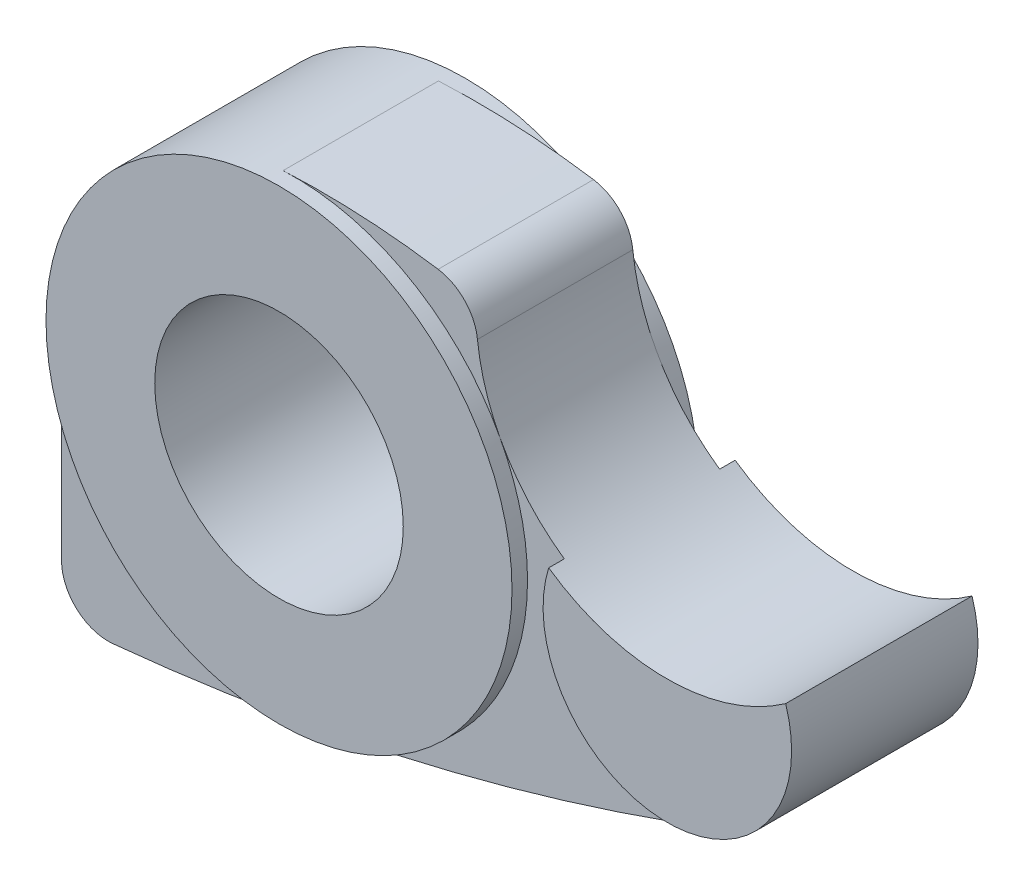
ISO-10303-21;
HEADER;
FILE_DESCRIPTION(('STEP AP214'),'2;1');
FILE_NAME('part.step','',(''),(''),'','','');
FILE_SCHEMA(('AUTOMOTIVE_DESIGN { 1 0 10303 214 1 1 1 1 }'));
ENDSEC;
DATA;
#1=APPLICATION_CONTEXT('core data for automotive mechanical design processes');
#2=APPLICATION_PROTOCOL_DEFINITION('international standard','automotive_design',2000,#1);
#3=PRODUCT_CONTEXT('',#1,'mechanical');
#4=PRODUCT('Part','Part','',(#3));
#5=PRODUCT_RELATED_PRODUCT_CATEGORY('part','',(#4));
#6=PRODUCT_DEFINITION_FORMATION('','',#4);
#7=PRODUCT_DEFINITION_CONTEXT('part definition',#1,'design');
#8=PRODUCT_DEFINITION('design','',#6,#7);
#9=PRODUCT_DEFINITION_SHAPE('','',#8);
#10=(LENGTH_UNIT() NAMED_UNIT(*) SI_UNIT(.MILLI.,.METRE.));
#11=(NAMED_UNIT(*) PLANE_ANGLE_UNIT() SI_UNIT($,.RADIAN.));
#12=(NAMED_UNIT(*) SI_UNIT($,.STERADIAN.) SOLID_ANGLE_UNIT());
#13=UNCERTAINTY_MEASURE_WITH_UNIT(LENGTH_MEASURE(1.E-05),#10,'distance_accuracy_value','');
#14=(GEOMETRIC_REPRESENTATION_CONTEXT(3) GLOBAL_UNCERTAINTY_ASSIGNED_CONTEXT((#13)) GLOBAL_UNIT_ASSIGNED_CONTEXT((#10,
#11,#12)) REPRESENTATION_CONTEXT('',''));
#15=CARTESIAN_POINT('',(0.,0.,0.));
#16=DIRECTION('',(0.,0.,1.));
#17=DIRECTION('',(1.,0.,0.));
#18=AXIS2_PLACEMENT_3D('',#15,#16,#17);
#19=CARTESIAN_POINT('',(0.,0.,5.));
#20=DIRECTION('',(0.,0.,1.));
#21=DIRECTION('',(1.,0.,0.));
#22=AXIS2_PLACEMENT_3D('',#19,#20,#21);
#23=PLANE('',#22);
#24=CARTESIAN_POINT('',(-26.2799999999999,132.417376503237,5.));
#25=DIRECTION('',(0.,0.,1.));
#26=DIRECTION('',(1.,0.,0.));
#27=AXIS2_PLACEMENT_3D('',#24,#25,#26);
#28=CIRCLE('',#27,150.);
#29=CARTESIAN_POINT('',(2.91999999999999,-14.713041833693,5.));
#30=VERTEX_POINT('',#29);
#31=CARTESIAN_POINT('',(27.889014084507,-7.4601338875063,5.));
#32=VERTEX_POINT('',#31);
#33=EDGE_CURVE('E175',#30,#32,#28,.T.);
#34=ORIENTED_EDGE('',*,*,#33,.T.);
#35=CARTESIAN_POINT('',(25.,0.,5.));
#36=DIRECTION('',(0.,0.,1.));
#37=DIRECTION('',(1.,0.,0.));
#38=AXIS2_PLACEMENT_3D('',#35,#36,#37);
#39=CIRCLE('',#38,8.);
#40=CARTESIAN_POINT('',(17.364205718864,2.38634567826439,5.));
#41=VERTEX_POINT('',#40);
#42=EDGE_CURVE('E56',#32,#41,#39,.F.);
#43=ORIENTED_EDGE('',*,*,#42,.T.);
#44=CARTESIAN_POINT('',(24.9499498997493,13.25,5.));
#45=DIRECTION('',(0.,0.,1.));
#46=DIRECTION('',(1.,0.,0.));
#47=AXIS2_PLACEMENT_3D('',#44,#45,#46);
#48=CIRCLE('',#47,13.25);
#49=CARTESIAN_POINT('',(13.2477610087165,7.0353982300885,5.));
#50=VERTEX_POINT('',#49);
#51=EDGE_CURVE('E149',#50,#41,#48,.T.);
#52=ORIENTED_EDGE('',*,*,#51,.F.);
#53=CARTESIAN_POINT('',(0.,0.,5.));
#54=DIRECTION('',(0.,0.,1.));
#55=DIRECTION('',(1.,0.,0.));
#56=AXIS2_PLACEMENT_3D('',#53,#54,#55);
#57=CIRCLE('',#56,15.);
#58=EDGE_CURVE('E159',#50,#30,#57,.F.);
#59=ORIENTED_EDGE('',*,*,#58,.T.);
#60=EDGE_LOOP('',(#34,#43,#52,#59));
#61=FACE_BOUND('',#60,.T.);
#62=ADVANCED_FACE('F41',(#61),#23,.T.);
#63=CARTESIAN_POINT('',(0.,0.,-5.));
#64=DIRECTION('',(0.,0.,1.));
#65=DIRECTION('',(1.,0.,0.));
#66=AXIS2_PLACEMENT_3D('',#63,#64,#65);
#67=PLANE('',#66);
#68=CARTESIAN_POINT('',(25.,0.,-5.));
#69=DIRECTION('',(0.,0.,1.));
#70=DIRECTION('',(1.,0.,0.));
#71=AXIS2_PLACEMENT_3D('',#68,#69,#70);
#72=CIRCLE('',#71,8.);
#73=CARTESIAN_POINT('',(27.889014084507,-7.46013388750631,-5.));
#74=VERTEX_POINT('',#73);
#75=CARTESIAN_POINT('',(17.364205718864,2.38634567826438,-5.));
#76=VERTEX_POINT('',#75);
#77=EDGE_CURVE('E11',#74,#76,#72,.F.);
#78=ORIENTED_EDGE('',*,*,#77,.F.);
#79=CARTESIAN_POINT('',(-26.2799999999999,132.417376503237,-5.));
#80=DIRECTION('',(0.,0.,1.));
#81=DIRECTION('',(1.,0.,0.));
#82=AXIS2_PLACEMENT_3D('',#79,#80,#81);
#83=CIRCLE('',#82,150.);
#84=CARTESIAN_POINT('',(2.91999999999999,-14.713041833693,-5.));
#85=VERTEX_POINT('',#84);
#86=EDGE_CURVE('E192',#85,#74,#83,.T.);
#87=ORIENTED_EDGE('',*,*,#86,.F.);
#88=CARTESIAN_POINT('',(0.,0.,-5.));
#89=DIRECTION('',(0.,0.,1.));
#90=DIRECTION('',(1.,0.,0.));
#91=AXIS2_PLACEMENT_3D('',#88,#89,#90);
#92=CIRCLE('',#91,15.);
#93=CARTESIAN_POINT('',(13.2477610087165,7.0353982300885,-5.));
#94=VERTEX_POINT('',#93);
#95=EDGE_CURVE('E213',#94,#85,#92,.F.);
#96=ORIENTED_EDGE('',*,*,#95,.F.);
#97=CARTESIAN_POINT('',(24.9499498997493,13.25,-5.));
#98=DIRECTION('',(0.,0.,1.));
#99=DIRECTION('',(1.,0.,0.));
#100=AXIS2_PLACEMENT_3D('',#97,#98,#99);
#101=CIRCLE('',#100,13.25);
#102=EDGE_CURVE('E183',#94,#76,#101,.T.);
#103=ORIENTED_EDGE('',*,*,#102,.T.);
#104=EDGE_LOOP('',(#78,#87,#96,#103));
#105=FACE_BOUND('',#104,.T.);
#106=ADVANCED_FACE('F259',(#105),#67,.F.);
#107=CARTESIAN_POINT('',(-11.7085714285714,-16.8731907452927,5.));
#108=VERTEX_POINT('',#107);
#109=EDGE_CURVE('E176',#108,#30,#28,.T.);
#110=ORIENTED_EDGE('',*,*,#109,.T.);
#111=CARTESIAN_POINT('',(-15.,0.,5.));
#112=VERTEX_POINT('',#111);
#113=EDGE_CURVE('E64',#30,#112,#57,.F.);
#114=ORIENTED_EDGE('',*,*,#113,.T.);
#115=DIRECTION('',(0.,-1.,0.));
#116=VECTOR('',#115,1.);
#117=CARTESIAN_POINT('',(-15.,0.,5.));
#118=LINE('',#117,#116);
#119=CARTESIAN_POINT('',(-15.,-13.8873794003221,5.));
#120=VERTEX_POINT('',#119);
#121=EDGE_CURVE('E171',#112,#120,#118,.T.);
#122=ORIENTED_EDGE('',*,*,#121,.T.);
#123=CARTESIAN_POINT('',(-12.,-13.8873794003221,5.));
#124=DIRECTION('',(0.,0.,1.));
#125=DIRECTION('',(1.,0.,0.));
#126=AXIS2_PLACEMENT_3D('',#123,#124,#125);
#127=CIRCLE('',#126,2.99999999999998);
#128=EDGE_CURVE('E173',#120,#108,#127,.T.);
#129=ORIENTED_EDGE('',*,*,#128,.T.);
#130=EDGE_LOOP('',(#110,#114,#122,#129));
#131=FACE_BOUND('',#130,.T.);
#132=ADVANCED_FACE('F236',(#131),#23,.T.);
#133=CARTESIAN_POINT('',(1.72,-34.9577115955836,5.));
#134=DIRECTION('',(0.,0.,1.));
#135=DIRECTION('',(1.,0.,0.));
#136=AXIS2_PLACEMENT_3D('',#133,#134,#135);
#137=CIRCLE('',#136,50.);
#138=CARTESIAN_POINT('',(9.24521977808166,14.4727553988882,5.));
#139=VERTEX_POINT('',#138);
#140=CARTESIAN_POINT('',(-0.737142857142858,14.9818763981073,5.));
#141=VERTEX_POINT('',#140);
#142=EDGE_CURVE('E168',#139,#141,#137,.T.);
#143=ORIENTED_EDGE('',*,*,#142,.T.);
#144=EDGE_CURVE('E163',#141,#50,#57,.F.);
#145=ORIENTED_EDGE('',*,*,#144,.T.);
#146=CARTESIAN_POINT('',(11.776397663708,11.8287254015178,5.));
#147=VERTEX_POINT('',#146);
#148=EDGE_CURVE('E164',#147,#50,#48,.T.);
#149=ORIENTED_EDGE('',*,*,#148,.F.);
#150=CARTESIAN_POINT('',(8.79370659139676,11.5069273792199,5.));
#151=DIRECTION('',(0.,0.,1.));
#152=DIRECTION('',(1.,0.,0.));
#153=AXIS2_PLACEMENT_3D('',#150,#151,#152);
#154=CIRCLE('',#153,3.);
#155=EDGE_CURVE('E166',#147,#139,#154,.T.);
#156=ORIENTED_EDGE('',*,*,#155,.T.);
#157=EDGE_LOOP('',(#143,#145,#149,#156));
#158=FACE_BOUND('',#157,.T.);
#159=ADVANCED_FACE('F241',(#158),#23,.T.);
#160=CARTESIAN_POINT('',(-15.,0.,-5.));
#161=VERTEX_POINT('',#160);
#162=EDGE_CURVE('E49',#85,#161,#92,.F.);
#163=ORIENTED_EDGE('',*,*,#162,.F.);
#164=CARTESIAN_POINT('',(-11.7085714285714,-16.8731907452927,-5.));
#165=VERTEX_POINT('',#164);
#166=EDGE_CURVE('E193',#165,#85,#83,.T.);
#167=ORIENTED_EDGE('',*,*,#166,.F.);
#168=CARTESIAN_POINT('',(-12.,-13.8873794003221,-5.));
#169=DIRECTION('',(0.,0.,1.));
#170=DIRECTION('',(1.,0.,0.));
#171=AXIS2_PLACEMENT_3D('',#168,#169,#170);
#172=CIRCLE('',#171,2.99999999999998);
#173=CARTESIAN_POINT('',(-15.,-13.8873794003221,-5.));
#174=VERTEX_POINT('',#173);
#175=EDGE_CURVE('E190',#174,#165,#172,.T.);
#176=ORIENTED_EDGE('',*,*,#175,.F.);
#177=DIRECTION('',(0.,-1.,0.));
#178=VECTOR('',#177,1.);
#179=CARTESIAN_POINT('',(-15.,0.,-5.));
#180=LINE('',#179,#178);
#181=EDGE_CURVE('E188',#161,#174,#180,.T.);
#182=ORIENTED_EDGE('',*,*,#181,.F.);
#183=EDGE_LOOP('',(#163,#167,#176,#182));
#184=FACE_BOUND('',#183,.T.);
#185=ADVANCED_FACE('F225',(#184),#67,.F.);
#186=CARTESIAN_POINT('',(-0.737142857142859,14.9818763981073,-5.));
#187=VERTEX_POINT('',#186);
#188=EDGE_CURVE('E215',#187,#94,#92,.F.);
#189=ORIENTED_EDGE('',*,*,#188,.F.);
#190=CARTESIAN_POINT('',(1.72,-34.9577115955836,-5.));
#191=DIRECTION('',(0.,0.,1.));
#192=DIRECTION('',(1.,0.,0.));
#193=AXIS2_PLACEMENT_3D('',#190,#191,#192);
#194=CIRCLE('',#193,50.);
#195=CARTESIAN_POINT('',(9.24521977808166,14.4727553988882,-5.));
#196=VERTEX_POINT('',#195);
#197=EDGE_CURVE('E185',#196,#187,#194,.T.);
#198=ORIENTED_EDGE('',*,*,#197,.F.);
#199=CARTESIAN_POINT('',(8.79370659139676,11.5069273792199,-5.));
#200=DIRECTION('',(0.,0.,1.));
#201=DIRECTION('',(1.,0.,0.));
#202=AXIS2_PLACEMENT_3D('',#199,#200,#201);
#203=CIRCLE('',#202,3.);
#204=CARTESIAN_POINT('',(11.776397663708,11.8287254015178,-5.));
#205=VERTEX_POINT('',#204);
#206=EDGE_CURVE('E182',#205,#196,#203,.T.);
#207=ORIENTED_EDGE('',*,*,#206,.F.);
#208=EDGE_CURVE('E179',#205,#94,#101,.T.);
#209=ORIENTED_EDGE('',*,*,#208,.T.);
#210=EDGE_LOOP('',(#189,#198,#207,#209));
#211=FACE_BOUND('',#210,.T.);
#212=ADVANCED_FACE('F256',(#211),#67,.F.);
#213=CARTESIAN_POINT('',(24.9499498997493,13.25,5.));
#214=DIRECTION('',(0.,0.,-1.));
#215=DIRECTION('',(-1.,0.,0.));
#216=AXIS2_PLACEMENT_3D('',#213,#214,#215);
#217=CYLINDRICAL_SURFACE('',#216,13.25);
#218=DIRECTION('',(0.,0.,-1.));
#219=VECTOR('',#218,1.);
#220=CARTESIAN_POINT('',(17.364205718864,2.38634567826438,6.));
#221=LINE('',#220,#219);
#222=CARTESIAN_POINT('',(17.364205718864,2.38634567826438,-6.));
#223=VERTEX_POINT('',#222);
#224=EDGE_CURVE('E140',#76,#223,#221,.T.);
#225=ORIENTED_EDGE('',*,*,#224,.F.);
#226=ORIENTED_EDGE('',*,*,#102,.F.);
#227=ORIENTED_EDGE('',*,*,#208,.F.);
#228=DIRECTION('',(0.,0.,-1.));
#229=VECTOR('',#228,1.);
#230=CARTESIAN_POINT('',(11.776397663708,11.8287254015178,5.));
#231=LINE('',#230,#229);
#232=EDGE_CURVE('E212',#147,#205,#231,.T.);
#233=ORIENTED_EDGE('',*,*,#232,.F.);
#234=ORIENTED_EDGE('',*,*,#148,.T.);
#235=ORIENTED_EDGE('',*,*,#51,.T.);
#236=CARTESIAN_POINT('',(17.364205718864,2.38634567826438,6.));
#237=VERTEX_POINT('',#236);
#238=EDGE_CURVE('E135',#237,#41,#221,.T.);
#239=ORIENTED_EDGE('',*,*,#238,.F.);
#240=CARTESIAN_POINT('',(24.9499498997493,13.25,6.));
#241=DIRECTION('',(0.,0.,-1.));
#242=DIRECTION('',(1.,0.,0.));
#243=AXIS2_PLACEMENT_3D('',#240,#241,#242);
#244=CIRCLE('',#243,13.25);
#245=CARTESIAN_POINT('',(32.6175484365729,2.44396313729681,6.));
#246=VERTEX_POINT('',#245);
#247=EDGE_CURVE('E141',#246,#237,#244,.T.);
#248=ORIENTED_EDGE('',*,*,#247,.F.);
#249=DIRECTION('',(0.,0.,-1.));
#250=VECTOR('',#249,1.);
#251=CARTESIAN_POINT('',(32.6175484365729,2.44396313729681,5.));
#252=LINE('',#251,#250);
#253=CARTESIAN_POINT('',(32.6175484365729,2.44396313729681,-6.));
#254=VERTEX_POINT('',#253);
#255=EDGE_CURVE('E137',#246,#254,#252,.T.);
#256=ORIENTED_EDGE('',*,*,#255,.T.);
#257=CARTESIAN_POINT('',(24.9499498997493,13.25,-6.));
#258=DIRECTION('',(0.,0.,-1.));
#259=DIRECTION('',(1.,0.,0.));
#260=AXIS2_PLACEMENT_3D('',#257,#258,#259);
#261=CIRCLE('',#260,13.25);
#262=EDGE_CURVE('E414',#254,#223,#261,.T.);
#263=ORIENTED_EDGE('',*,*,#262,.T.);
#264=EDGE_LOOP('',(#225,#226,#227,#233,#234,#235,#239,#248,#256,#263));
#265=FACE_BOUND('',#264,.T.);
#266=ADVANCED_FACE('F43',(#265),#217,.F.);
#267=CARTESIAN_POINT('',(8.79370659139676,11.5069273792199,5.));
#268=DIRECTION('',(0.,0.,-1.));
#269=DIRECTION('',(-1.,0.,0.));
#270=AXIS2_PLACEMENT_3D('',#267,#268,#269);
#271=CYLINDRICAL_SURFACE('',#270,3.);
#272=ORIENTED_EDGE('',*,*,#206,.T.);
#273=DIRECTION('',(0.,0.,-1.));
#274=VECTOR('',#273,1.);
#275=CARTESIAN_POINT('',(9.24521977808166,14.4727553988882,5.));
#276=LINE('',#275,#274);
#277=EDGE_CURVE('E209',#139,#196,#276,.T.);
#278=ORIENTED_EDGE('',*,*,#277,.F.);
#279=ORIENTED_EDGE('',*,*,#155,.F.);
#280=ORIENTED_EDGE('',*,*,#232,.T.);
#281=EDGE_LOOP('',(#272,#278,#279,#280));
#282=FACE_BOUND('',#281,.T.);
#283=ADVANCED_FACE('F251',(#282),#271,.T.);
#284=CARTESIAN_POINT('',(1.72,-34.9577115955836,5.));
#285=DIRECTION('',(0.,0.,-1.));
#286=DIRECTION('',(-1.,0.,0.));
#287=AXIS2_PLACEMENT_3D('',#284,#285,#286);
#288=CYLINDRICAL_SURFACE('',#287,50.);
#289=ORIENTED_EDGE('',*,*,#197,.T.);
#290=DIRECTION('',(0.,0.,-1.));
#291=VECTOR('',#290,1.);
#292=CARTESIAN_POINT('',(-0.737142857142859,14.9818763981073,5.));
#293=LINE('',#292,#291);
#294=EDGE_CURVE('E206',#141,#187,#293,.T.);
#295=ORIENTED_EDGE('',*,*,#294,.F.);
#296=ORIENTED_EDGE('',*,*,#142,.F.);
#297=ORIENTED_EDGE('',*,*,#277,.T.);
#298=EDGE_LOOP('',(#289,#295,#296,#297));
#299=FACE_BOUND('',#298,.T.);
#300=ADVANCED_FACE('F254',(#299),#288,.T.);
#301=CARTESIAN_POINT('',(0.,0.,5.));
#302=DIRECTION('',(0.,0.,-1.));
#303=DIRECTION('',(-1.,0.,0.));
#304=AXIS2_PLACEMENT_3D('',#301,#302,#303);
#305=CYLINDRICAL_SURFACE('',#304,15.);
#306=ORIENTED_EDGE('',*,*,#294,.T.);
#307=ORIENTED_EDGE('',*,*,#188,.T.);
#308=ORIENTED_EDGE('',*,*,#95,.T.);
#309=ORIENTED_EDGE('',*,*,#162,.T.);
#310=DIRECTION('',(0.,0.,-1.));
#311=VECTOR('',#310,1.);
#312=CARTESIAN_POINT('',(-15.,0.,5.));
#313=LINE('',#312,#311);
#314=EDGE_CURVE('E204',#112,#161,#313,.T.);
#315=ORIENTED_EDGE('',*,*,#314,.F.);
#316=ORIENTED_EDGE('',*,*,#113,.F.);
#317=ORIENTED_EDGE('',*,*,#58,.F.);
#318=ORIENTED_EDGE('',*,*,#144,.F.);
#319=EDGE_LOOP('',(#306,#307,#308,#309,#315,#316,#317,#318));
#320=FACE_BOUND('',#319,.T.);
#321=CARTESIAN_POINT('',(0.,0.,-6.));
#322=DIRECTION('',(0.,0.,1.));
#323=DIRECTION('',(1.,0.,0.));
#324=AXIS2_PLACEMENT_3D('',#321,#322,#323);
#325=CIRCLE('',#324,15.);
#326=CARTESIAN_POINT('',(15.,0.,-6.));
#327=VERTEX_POINT('',#326);
#328=EDGE_CURVE('E151',#327,#327,#325,.T.);
#329=ORIENTED_EDGE('',*,*,#328,.T.);
#330=EDGE_LOOP('',(#329));
#331=FACE_BOUND('',#330,.T.);
#332=CARTESIAN_POINT('',(0.,0.,6.));
#333=DIRECTION('',(0.,0.,1.));
#334=DIRECTION('',(1.,0.,0.));
#335=AXIS2_PLACEMENT_3D('',#332,#333,#334);
#336=CIRCLE('',#335,15.);
#337=CARTESIAN_POINT('',(15.,0.,6.));
#338=VERTEX_POINT('',#337);
#339=EDGE_CURVE('E156',#338,#338,#336,.T.);
#340=ORIENTED_EDGE('',*,*,#339,.F.);
#341=EDGE_LOOP('',(#340));
#342=FACE_BOUND('',#341,.T.);
#343=ADVANCED_FACE('F219',(#320,#331,#342),#305,.T.);
#344=CARTESIAN_POINT('',(-15.,0.,5.));
#345=DIRECTION('',(1.,0.,0.));
#346=DIRECTION('',(0.,1.,0.));
#347=AXIS2_PLACEMENT_3D('',#344,#345,#346);
#348=PLANE('',#347);
#349=ORIENTED_EDGE('',*,*,#181,.T.);
#350=DIRECTION('',(0.,0.,-1.));
#351=VECTOR('',#350,1.);
#352=CARTESIAN_POINT('',(-15.,-13.8873794003221,5.));
#353=LINE('',#352,#351);
#354=EDGE_CURVE('E201',#120,#174,#353,.T.);
#355=ORIENTED_EDGE('',*,*,#354,.F.);
#356=ORIENTED_EDGE('',*,*,#121,.F.);
#357=ORIENTED_EDGE('',*,*,#314,.T.);
#358=EDGE_LOOP('',(#349,#355,#356,#357));
#359=FACE_BOUND('',#358,.T.);
#360=ADVANCED_FACE('F229',(#359),#348,.F.);
#361=CARTESIAN_POINT('',(-12.,-13.8873794003221,5.));
#362=DIRECTION('',(0.,0.,-1.));
#363=DIRECTION('',(-1.,0.,0.));
#364=AXIS2_PLACEMENT_3D('',#361,#362,#363);
#365=CYLINDRICAL_SURFACE('',#364,2.99999999999998);
#366=ORIENTED_EDGE('',*,*,#175,.T.);
#367=DIRECTION('',(0.,0.,-1.));
#368=VECTOR('',#367,1.);
#369=CARTESIAN_POINT('',(-11.7085714285714,-16.8731907452927,5.));
#370=LINE('',#369,#368);
#371=EDGE_CURVE('E198',#108,#165,#370,.T.);
#372=ORIENTED_EDGE('',*,*,#371,.F.);
#373=ORIENTED_EDGE('',*,*,#128,.F.);
#374=ORIENTED_EDGE('',*,*,#354,.T.);
#375=EDGE_LOOP('',(#366,#372,#373,#374));
#376=FACE_BOUND('',#375,.T.);
#377=ADVANCED_FACE('F232',(#376),#365,.T.);
#378=CARTESIAN_POINT('',(-26.2799999999999,132.417376503237,5.));
#379=DIRECTION('',(0.,0.,-1.));
#380=DIRECTION('',(-1.,0.,0.));
#381=AXIS2_PLACEMENT_3D('',#378,#379,#380);
#382=CYLINDRICAL_SURFACE('',#381,150.);
#383=ORIENTED_EDGE('',*,*,#33,.F.);
#384=ORIENTED_EDGE('',*,*,#109,.F.);
#385=ORIENTED_EDGE('',*,*,#371,.T.);
#386=ORIENTED_EDGE('',*,*,#166,.T.);
#387=ORIENTED_EDGE('',*,*,#86,.T.);
#388=DIRECTION('',(0.,0.,-1.));
#389=VECTOR('',#388,1.);
#390=CARTESIAN_POINT('',(27.889014084507,-7.4601338875063,5.));
#391=LINE('',#390,#389);
#392=EDGE_CURVE('E196',#32,#74,#391,.T.);
#393=ORIENTED_EDGE('',*,*,#392,.F.);
#394=EDGE_LOOP('',(#383,#384,#385,#386,#387,#393));
#395=FACE_BOUND('',#394,.T.);
#396=ADVANCED_FACE('F376',(#395),#382,.T.);
#397=CARTESIAN_POINT('',(25.,0.,5.));
#398=DIRECTION('',(0.,0.,-1.));
#399=DIRECTION('',(-1.,0.,0.));
#400=AXIS2_PLACEMENT_3D('',#397,#398,#399);
#401=CYLINDRICAL_SURFACE('',#400,8.);
#402=ORIENTED_EDGE('',*,*,#392,.T.);
#403=ORIENTED_EDGE('',*,*,#77,.T.);
#404=ORIENTED_EDGE('',*,*,#224,.T.);
#405=CARTESIAN_POINT('',(25.,0.,-6.));
#406=DIRECTION('',(0.,0.,1.));
#407=DIRECTION('',(1.,0.,0.));
#408=AXIS2_PLACEMENT_3D('',#405,#406,#407);
#409=CIRCLE('',#408,8.);
#410=EDGE_CURVE('E145',#223,#254,#409,.T.);
#411=ORIENTED_EDGE('',*,*,#410,.T.);
#412=ORIENTED_EDGE('',*,*,#255,.F.);
#413=CARTESIAN_POINT('',(25.,0.,6.));
#414=DIRECTION('',(0.,0.,1.));
#415=DIRECTION('',(1.,0.,0.));
#416=AXIS2_PLACEMENT_3D('',#413,#414,#415);
#417=CIRCLE('',#416,8.);
#418=EDGE_CURVE('E130',#237,#246,#417,.T.);
#419=ORIENTED_EDGE('',*,*,#418,.F.);
#420=ORIENTED_EDGE('',*,*,#238,.T.);
#421=ORIENTED_EDGE('',*,*,#42,.F.);
#422=EDGE_LOOP('',(#402,#403,#404,#411,#412,#419,#420,#421));
#423=FACE_BOUND('',#422,.T.);
#424=ADVANCED_FACE('F133',(#423),#401,.T.);
#425=CARTESIAN_POINT('',(0.,0.,-6.));
#426=DIRECTION('',(0.,0.,1.));
#427=DIRECTION('',(1.,0.,0.));
#428=AXIS2_PLACEMENT_3D('',#425,#426,#427);
#429=PLANE('',#428);
#430=CARTESIAN_POINT('',(0.,0.,-6.));
#431=DIRECTION('',(0.,0.,1.));
#432=DIRECTION('',(1.,0.,0.));
#433=AXIS2_PLACEMENT_3D('',#430,#431,#432);
#434=CIRCLE('',#433,8.);
#435=CARTESIAN_POINT('',(8.,0.,-6.));
#436=VERTEX_POINT('',#435);
#437=EDGE_CURVE('E409',#436,#436,#434,.T.);
#438=ORIENTED_EDGE('',*,*,#437,.T.);
#439=EDGE_LOOP('',(#438));
#440=FACE_BOUND('',#439,.T.);
#441=ORIENTED_EDGE('',*,*,#328,.F.);
#442=EDGE_LOOP('',(#441));
#443=FACE_BOUND('',#442,.T.);
#444=ADVANCED_FACE('F324',(#440,#443),#429,.F.);
#445=CARTESIAN_POINT('',(0.,0.,6.));
#446=DIRECTION('',(0.,0.,1.));
#447=DIRECTION('',(1.,0.,0.));
#448=AXIS2_PLACEMENT_3D('',#445,#446,#447);
#449=PLANE('',#448);
#450=CARTESIAN_POINT('',(0.,0.,6.));
#451=DIRECTION('',(0.,0.,1.));
#452=DIRECTION('',(1.,0.,0.));
#453=AXIS2_PLACEMENT_3D('',#450,#451,#452);
#454=CIRCLE('',#453,8.);
#455=CARTESIAN_POINT('',(8.,0.,6.));
#456=VERTEX_POINT('',#455);
#457=EDGE_CURVE('E412',#456,#456,#454,.T.);
#458=ORIENTED_EDGE('',*,*,#457,.F.);
#459=EDGE_LOOP('',(#458));
#460=FACE_BOUND('',#459,.T.);
#461=ORIENTED_EDGE('',*,*,#339,.T.);
#462=EDGE_LOOP('',(#461));
#463=FACE_BOUND('',#462,.T.);
#464=ADVANCED_FACE('F329',(#460,#463),#449,.T.);
#465=CARTESIAN_POINT('',(24.9749749498746,6.625,-6.));
#466=DIRECTION('',(0.,0.,1.));
#467=DIRECTION('',(1.,0.,0.));
#468=AXIS2_PLACEMENT_3D('',#465,#466,#467);
#469=PLANE('',#468);
#470=ORIENTED_EDGE('',*,*,#262,.F.);
#471=ORIENTED_EDGE('',*,*,#410,.F.);
#472=EDGE_LOOP('',(#470,#471));
#473=FACE_BOUND('',#472,.T.);
#474=ADVANCED_FACE('F339',(#473),#469,.F.);
#475=CARTESIAN_POINT('',(24.9749749498746,6.625,6.));
#476=DIRECTION('',(0.,0.,1.));
#477=DIRECTION('',(1.,0.,0.));
#478=AXIS2_PLACEMENT_3D('',#475,#476,#477);
#479=PLANE('',#478);
#480=ORIENTED_EDGE('',*,*,#247,.T.);
#481=ORIENTED_EDGE('',*,*,#418,.T.);
#482=EDGE_LOOP('',(#480,#481));
#483=FACE_BOUND('',#482,.T.);
#484=ADVANCED_FACE('F143',(#483),#479,.T.);
#485=CARTESIAN_POINT('',(0.,0.,-6.));
#486=DIRECTION('',(0.,0.,1.));
#487=DIRECTION('',(1.,0.,0.));
#488=AXIS2_PLACEMENT_3D('',#485,#486,#487);
#489=CYLINDRICAL_SURFACE('',#488,8.);
#490=ORIENTED_EDGE('',*,*,#437,.F.);
#491=EDGE_LOOP('',(#490));
#492=FACE_BOUND('',#491,.T.);
#493=ORIENTED_EDGE('',*,*,#457,.T.);
#494=EDGE_LOOP('',(#493));
#495=FACE_BOUND('',#494,.T.);
#496=ADVANCED_FACE('F395',(#492,#495),#489,.F.);
#497=CLOSED_SHELL('',(#62,#106,#132,#159,#185,#212,#266,#283,#300,#343,#360,#377,#396,#424,#444,
#464,#474,#484,#496));
#498=MANIFOLD_SOLID_BREP('B2',#497);
#499=ADVANCED_BREP_SHAPE_REPRESENTATION('',(#18,#498),#14);
#500=SHAPE_DEFINITION_REPRESENTATION(#9,#499);
ENDSEC;
END-ISO-10303-21;
